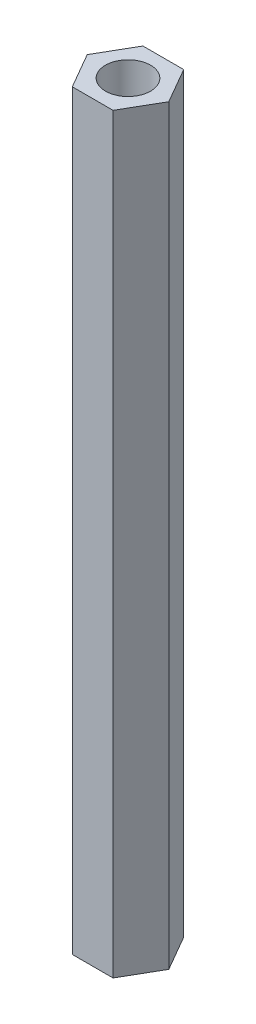
ISO-10303-21;
HEADER;
FILE_DESCRIPTION(('STEP AP214'),'2;1');
FILE_NAME('part.step','',(''),(''),'','','');
FILE_SCHEMA(('AUTOMOTIVE_DESIGN { 1 0 10303 214 1 1 1 1 }'));
ENDSEC;
DATA;
#1=APPLICATION_CONTEXT('core data for automotive mechanical design processes');
#2=APPLICATION_PROTOCOL_DEFINITION('international standard','automotive_design',2000,#1);
#3=PRODUCT_CONTEXT('',#1,'mechanical');
#4=PRODUCT('Part','Part','',(#3));
#5=PRODUCT_RELATED_PRODUCT_CATEGORY('part','',(#4));
#6=PRODUCT_DEFINITION_FORMATION('','',#4);
#7=PRODUCT_DEFINITION_CONTEXT('part definition',#1,'design');
#8=PRODUCT_DEFINITION('design','',#6,#7);
#9=PRODUCT_DEFINITION_SHAPE('','',#8);
#10=(LENGTH_UNIT() NAMED_UNIT(*) SI_UNIT(.MILLI.,.METRE.));
#11=(NAMED_UNIT(*) PLANE_ANGLE_UNIT() SI_UNIT($,.RADIAN.));
#12=(NAMED_UNIT(*) SI_UNIT($,.STERADIAN.) SOLID_ANGLE_UNIT());
#13=UNCERTAINTY_MEASURE_WITH_UNIT(LENGTH_MEASURE(1.E-05),#10,'distance_accuracy_value','');
#14=(GEOMETRIC_REPRESENTATION_CONTEXT(3) GLOBAL_UNCERTAINTY_ASSIGNED_CONTEXT((#13)) GLOBAL_UNIT_ASSIGNED_CONTEXT((#10,
#11,#12)) REPRESENTATION_CONTEXT('',''));
#15=CARTESIAN_POINT('',(0.,0.,0.));
#16=DIRECTION('',(0.,0.,1.));
#17=DIRECTION('',(1.,0.,0.));
#18=AXIS2_PLACEMENT_3D('',#15,#16,#17);
#19=CARTESIAN_POINT('',(0.,50.,0.));
#20=DIRECTION('',(0.,1.,0.));
#21=DIRECTION('',(0.,0.,1.));
#22=AXIS2_PLACEMENT_3D('',#19,#20,#21);
#23=PLANE('',#22);
#24=DIRECTION('',(0.5,0.,-0.866025403784439));
#25=VECTOR('',#24,1.);
#26=CARTESIAN_POINT('',(1.35677313259562,50.,2.35));
#27=LINE('',#26,#25);
#28=CARTESIAN_POINT('',(1.35677313259562,50.,2.35));
#29=VERTEX_POINT('',#28);
#30=CARTESIAN_POINT('',(2.71354626519124,50.,0.));
#31=VERTEX_POINT('',#30);
#32=EDGE_CURVE('E131',#29,#31,#27,.T.);
#33=ORIENTED_EDGE('',*,*,#32,.T.);
#34=DIRECTION('',(-0.5,0.,-0.866025403784439));
#35=VECTOR('',#34,1.);
#36=CARTESIAN_POINT('',(2.71354626519124,50.,0.));
#37=LINE('',#36,#35);
#38=CARTESIAN_POINT('',(1.35677313259562,50.,-2.35));
#39=VERTEX_POINT('',#38);
#40=EDGE_CURVE('E89',#31,#39,#37,.T.);
#41=ORIENTED_EDGE('',*,*,#40,.T.);
#42=DIRECTION('',(-1.,0.,0.));
#43=VECTOR('',#42,1.);
#44=CARTESIAN_POINT('',(1.35677313259562,50.,-2.35));
#45=LINE('',#44,#43);
#46=CARTESIAN_POINT('',(-1.35677313259562,50.,-2.35));
#47=VERTEX_POINT('',#46);
#48=EDGE_CURVE('E102',#39,#47,#45,.T.);
#49=ORIENTED_EDGE('',*,*,#48,.T.);
#50=DIRECTION('',(-0.5,0.,0.866025403784439));
#51=VECTOR('',#50,1.);
#52=CARTESIAN_POINT('',(-1.35677313259562,50.,-2.35));
#53=LINE('',#52,#51);
#54=CARTESIAN_POINT('',(-2.71354626519124,50.,0.));
#55=VERTEX_POINT('',#54);
#56=EDGE_CURVE('E96',#47,#55,#53,.T.);
#57=ORIENTED_EDGE('',*,*,#56,.T.);
#58=DIRECTION('',(0.5,0.,0.866025403784439));
#59=VECTOR('',#58,1.);
#60=CARTESIAN_POINT('',(-2.71354626519124,50.,0.));
#61=LINE('',#60,#59);
#62=CARTESIAN_POINT('',(-1.35677313259562,50.,2.35));
#63=VERTEX_POINT('',#62);
#64=EDGE_CURVE('E100',#55,#63,#61,.T.);
#65=ORIENTED_EDGE('',*,*,#64,.T.);
#66=DIRECTION('',(1.,0.,0.));
#67=VECTOR('',#66,1.);
#68=CARTESIAN_POINT('',(-1.35677313259562,50.,2.35));
#69=LINE('',#68,#67);
#70=EDGE_CURVE('E52',#63,#29,#69,.T.);
#71=ORIENTED_EDGE('',*,*,#70,.T.);
#72=EDGE_LOOP('',(#33,#41,#49,#57,#65,#71));
#73=FACE_BOUND('',#72,.T.);
#74=CARTESIAN_POINT('',(0.,50.,0.));
#75=DIRECTION('',(0.,1.,0.));
#76=DIRECTION('',(0.,0.,1.));
#77=AXIS2_PLACEMENT_3D('',#74,#75,#76);
#78=CIRCLE('',#77,1.5);
#79=CARTESIAN_POINT('',(0.,50.,1.5));
#80=VERTEX_POINT('',#79);
#81=EDGE_CURVE('E124',#80,#80,#78,.T.);
#82=ORIENTED_EDGE('',*,*,#81,.F.);
#83=EDGE_LOOP('',(#82));
#84=FACE_BOUND('',#83,.T.);
#85=ADVANCED_FACE('F35',(#73,#84),#23,.T.);
#86=CARTESIAN_POINT('',(0.,0.,0.));
#87=DIRECTION('',(0.,1.,0.));
#88=DIRECTION('',(0.,0.,1.));
#89=AXIS2_PLACEMENT_3D('',#86,#87,#88);
#90=PLANE('',#89);
#91=DIRECTION('',(0.5,0.,-0.866025403784439));
#92=VECTOR('',#91,1.);
#93=CARTESIAN_POINT('',(1.35677313259562,0.,2.35));
#94=LINE('',#93,#92);
#95=CARTESIAN_POINT('',(1.35677313259562,0.,2.35));
#96=VERTEX_POINT('',#95);
#97=CARTESIAN_POINT('',(2.71354626519124,0.,0.));
#98=VERTEX_POINT('',#97);
#99=EDGE_CURVE('E120',#96,#98,#94,.T.);
#100=ORIENTED_EDGE('',*,*,#99,.F.);
#101=DIRECTION('',(1.,0.,0.));
#102=VECTOR('',#101,1.);
#103=CARTESIAN_POINT('',(-1.35677313259562,0.,2.35));
#104=LINE('',#103,#102);
#105=CARTESIAN_POINT('',(-1.35677313259562,0.,2.35));
#106=VERTEX_POINT('',#105);
#107=EDGE_CURVE('E81',#106,#96,#104,.T.);
#108=ORIENTED_EDGE('',*,*,#107,.F.);
#109=DIRECTION('',(0.5,0.,0.866025403784439));
#110=VECTOR('',#109,1.);
#111=CARTESIAN_POINT('',(-2.71354626519124,0.,0.));
#112=LINE('',#111,#110);
#113=CARTESIAN_POINT('',(-2.71354626519124,0.,0.));
#114=VERTEX_POINT('',#113);
#115=EDGE_CURVE('E75',#114,#106,#112,.T.);
#116=ORIENTED_EDGE('',*,*,#115,.F.);
#117=DIRECTION('',(-0.5,0.,0.866025403784439));
#118=VECTOR('',#117,1.);
#119=CARTESIAN_POINT('',(-1.35677313259562,0.,-2.35));
#120=LINE('',#119,#118);
#121=CARTESIAN_POINT('',(-1.35677313259562,0.,-2.35));
#122=VERTEX_POINT('',#121);
#123=EDGE_CURVE('E110',#122,#114,#120,.T.);
#124=ORIENTED_EDGE('',*,*,#123,.F.);
#125=DIRECTION('',(-1.,0.,0.));
#126=VECTOR('',#125,1.);
#127=CARTESIAN_POINT('',(1.35677313259562,0.,-2.35));
#128=LINE('',#127,#126);
#129=CARTESIAN_POINT('',(1.35677313259562,0.,-2.35));
#130=VERTEX_POINT('',#129);
#131=EDGE_CURVE('E126',#130,#122,#128,.T.);
#132=ORIENTED_EDGE('',*,*,#131,.F.);
#133=DIRECTION('',(-0.5,0.,-0.866025403784439));
#134=VECTOR('',#133,1.);
#135=CARTESIAN_POINT('',(2.71354626519124,0.,0.));
#136=LINE('',#135,#134);
#137=EDGE_CURVE('E123',#98,#130,#136,.T.);
#138=ORIENTED_EDGE('',*,*,#137,.F.);
#139=EDGE_LOOP('',(#100,#108,#116,#124,#132,#138));
#140=FACE_BOUND('',#139,.T.);
#141=CARTESIAN_POINT('',(0.,0.,0.));
#142=DIRECTION('',(0.,1.,0.));
#143=DIRECTION('',(0.,0.,1.));
#144=AXIS2_PLACEMENT_3D('',#141,#142,#143);
#145=CIRCLE('',#144,1.5);
#146=CARTESIAN_POINT('',(0.,0.,1.5));
#147=VERTEX_POINT('',#146);
#148=EDGE_CURVE('E224',#147,#147,#145,.T.);
#149=ORIENTED_EDGE('',*,*,#148,.T.);
#150=EDGE_LOOP('',(#149));
#151=FACE_BOUND('',#150,.T.);
#152=ADVANCED_FACE('F140',(#140,#151),#90,.F.);
#153=CARTESIAN_POINT('',(1.35677313259562,50.,2.35));
#154=DIRECTION('',(-0.866025403784439,0.,-0.5));
#155=DIRECTION('',(-0.5,0.,0.866025403784439));
#156=AXIS2_PLACEMENT_3D('',#153,#154,#155);
#157=PLANE('',#156);
#158=ORIENTED_EDGE('',*,*,#99,.T.);
#159=DIRECTION('',(0.,-1.,0.));
#160=VECTOR('',#159,1.);
#161=CARTESIAN_POINT('',(2.71354626519124,50.,0.));
#162=LINE('',#161,#160);
#163=EDGE_CURVE('E11',#31,#98,#162,.T.);
#164=ORIENTED_EDGE('',*,*,#163,.F.);
#165=ORIENTED_EDGE('',*,*,#32,.F.);
#166=DIRECTION('',(0.,-1.,0.));
#167=VECTOR('',#166,1.);
#168=CARTESIAN_POINT('',(1.35677313259562,50.,2.35));
#169=LINE('',#168,#167);
#170=EDGE_CURVE('E116',#29,#96,#169,.T.);
#171=ORIENTED_EDGE('',*,*,#170,.T.);
#172=EDGE_LOOP('',(#158,#164,#165,#171));
#173=FACE_BOUND('',#172,.T.);
#174=ADVANCED_FACE('F37',(#173),#157,.F.);
#175=CARTESIAN_POINT('',(2.71354626519124,50.,0.));
#176=DIRECTION('',(-0.866025403784439,0.,0.5));
#177=DIRECTION('',(0.5,0.,0.866025403784439));
#178=AXIS2_PLACEMENT_3D('',#175,#176,#177);
#179=PLANE('',#178);
#180=ORIENTED_EDGE('',*,*,#137,.T.);
#181=DIRECTION('',(0.,-1.,0.));
#182=VECTOR('',#181,1.);
#183=CARTESIAN_POINT('',(1.35677313259562,50.,-2.35));
#184=LINE('',#183,#182);
#185=EDGE_CURVE('E44',#39,#130,#184,.T.);
#186=ORIENTED_EDGE('',*,*,#185,.F.);
#187=ORIENTED_EDGE('',*,*,#40,.F.);
#188=ORIENTED_EDGE('',*,*,#163,.T.);
#189=EDGE_LOOP('',(#180,#186,#187,#188));
#190=FACE_BOUND('',#189,.T.);
#191=ADVANCED_FACE('F165',(#190),#179,.F.);
#192=CARTESIAN_POINT('',(1.35677313259562,50.,-2.35));
#193=DIRECTION('',(0.,0.,1.));
#194=DIRECTION('',(1.,0.,0.));
#195=AXIS2_PLACEMENT_3D('',#192,#193,#194);
#196=PLANE('',#195);
#197=ORIENTED_EDGE('',*,*,#131,.T.);
#198=DIRECTION('',(0.,-1.,0.));
#199=VECTOR('',#198,1.);
#200=CARTESIAN_POINT('',(-1.35677313259562,50.,-2.35));
#201=LINE('',#200,#199);
#202=EDGE_CURVE('E111',#47,#122,#201,.T.);
#203=ORIENTED_EDGE('',*,*,#202,.F.);
#204=ORIENTED_EDGE('',*,*,#48,.F.);
#205=ORIENTED_EDGE('',*,*,#185,.T.);
#206=EDGE_LOOP('',(#197,#203,#204,#205));
#207=FACE_BOUND('',#206,.T.);
#208=ADVANCED_FACE('F137',(#207),#196,.F.);
#209=CARTESIAN_POINT('',(-1.35677313259562,50.,-2.35));
#210=DIRECTION('',(0.866025403784439,0.,0.5));
#211=DIRECTION('',(0.5,0.,-0.866025403784439));
#212=AXIS2_PLACEMENT_3D('',#209,#210,#211);
#213=PLANE('',#212);
#214=ORIENTED_EDGE('',*,*,#123,.T.);
#215=DIRECTION('',(0.,-1.,0.));
#216=VECTOR('',#215,1.);
#217=CARTESIAN_POINT('',(-2.71354626519124,50.,0.));
#218=LINE('',#217,#216);
#219=EDGE_CURVE('E107',#55,#114,#218,.T.);
#220=ORIENTED_EDGE('',*,*,#219,.F.);
#221=ORIENTED_EDGE('',*,*,#56,.F.);
#222=ORIENTED_EDGE('',*,*,#202,.T.);
#223=EDGE_LOOP('',(#214,#220,#221,#222));
#224=FACE_BOUND('',#223,.T.);
#225=ADVANCED_FACE('F108',(#224),#213,.F.);
#226=CARTESIAN_POINT('',(-2.71354626519124,50.,0.));
#227=DIRECTION('',(0.866025403784439,0.,-0.5));
#228=DIRECTION('',(-0.5,0.,-0.866025403784439));
#229=AXIS2_PLACEMENT_3D('',#226,#227,#228);
#230=PLANE('',#229);
#231=ORIENTED_EDGE('',*,*,#115,.T.);
#232=DIRECTION('',(0.,-1.,0.));
#233=VECTOR('',#232,1.);
#234=CARTESIAN_POINT('',(-1.35677313259562,50.,2.35));
#235=LINE('',#234,#233);
#236=EDGE_CURVE('E112',#63,#106,#235,.T.);
#237=ORIENTED_EDGE('',*,*,#236,.F.);
#238=ORIENTED_EDGE('',*,*,#64,.F.);
#239=ORIENTED_EDGE('',*,*,#219,.T.);
#240=EDGE_LOOP('',(#231,#237,#238,#239));
#241=FACE_BOUND('',#240,.T.);
#242=ADVANCED_FACE('F114',(#241),#230,.F.);
#243=CARTESIAN_POINT('',(-1.35677313259562,50.,2.35));
#244=DIRECTION('',(0.,0.,-1.));
#245=DIRECTION('',(-1.,0.,0.));
#246=AXIS2_PLACEMENT_3D('',#243,#244,#245);
#247=PLANE('',#246);
#248=ORIENTED_EDGE('',*,*,#107,.T.);
#249=ORIENTED_EDGE('',*,*,#170,.F.);
#250=ORIENTED_EDGE('',*,*,#70,.F.);
#251=ORIENTED_EDGE('',*,*,#236,.T.);
#252=EDGE_LOOP('',(#248,#249,#250,#251));
#253=FACE_BOUND('',#252,.T.);
#254=ADVANCED_FACE('F145',(#253),#247,.F.);
#255=CARTESIAN_POINT('',(0.,50.,0.));
#256=DIRECTION('',(0.,-1.,0.));
#257=DIRECTION('',(0.,0.,-1.));
#258=AXIS2_PLACEMENT_3D('',#255,#256,#257);
#259=CYLINDRICAL_SURFACE('',#258,1.5);
#260=ORIENTED_EDGE('',*,*,#81,.T.);
#261=EDGE_LOOP('',(#260));
#262=FACE_BOUND('',#261,.T.);
#263=ORIENTED_EDGE('',*,*,#148,.F.);
#264=EDGE_LOOP('',(#263));
#265=FACE_BOUND('',#264,.T.);
#266=ADVANCED_FACE('F147',(#262,#265),#259,.F.);
#267=CLOSED_SHELL('',(#85,#152,#174,#191,#208,#225,#242,#254,#266));
#268=MANIFOLD_SOLID_BREP('B2',#267);
#269=ADVANCED_BREP_SHAPE_REPRESENTATION('',(#18,#268),#14);
#270=SHAPE_DEFINITION_REPRESENTATION(#9,#269);
ENDSEC;
END-ISO-10303-21;
